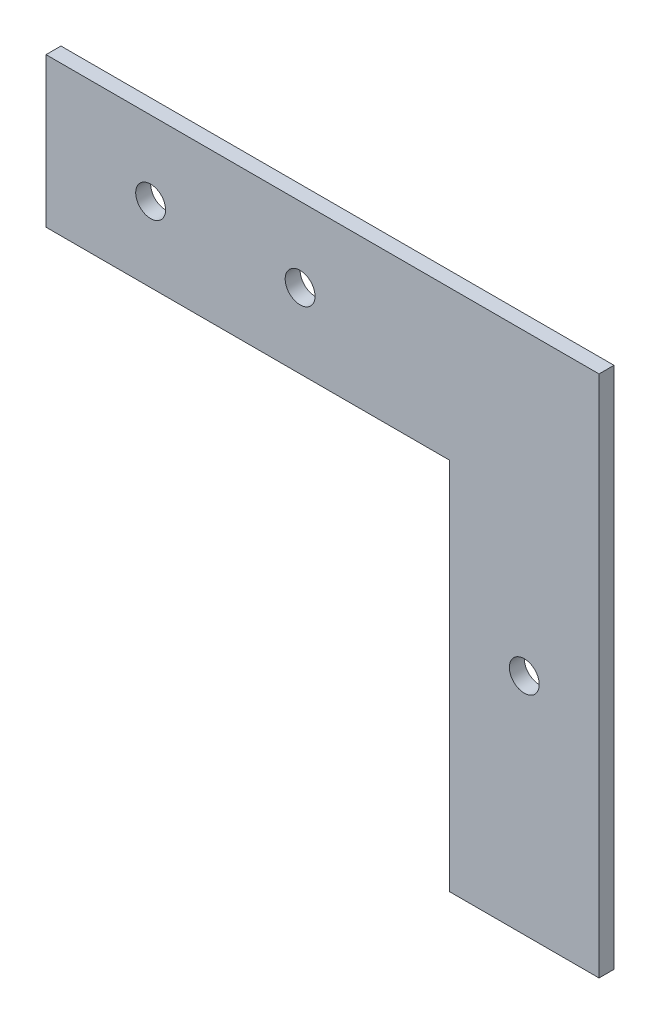
ISO-10303-21;
HEADER;
FILE_DESCRIPTION(('STEP AP214'),'2;1');
FILE_NAME('part.step','',(''),(''),'','','');
FILE_SCHEMA(('AUTOMOTIVE_DESIGN { 1 0 10303 214 1 1 1 1 }'));
ENDSEC;
DATA;
#1=APPLICATION_CONTEXT('core data for automotive mechanical design processes');
#2=APPLICATION_PROTOCOL_DEFINITION('international standard','automotive_design',2000,#1);
#3=PRODUCT_CONTEXT('',#1,'mechanical');
#4=PRODUCT('Part','Part','',(#3));
#5=PRODUCT_RELATED_PRODUCT_CATEGORY('part','',(#4));
#6=PRODUCT_DEFINITION_FORMATION('','',#4);
#7=PRODUCT_DEFINITION_CONTEXT('part definition',#1,'design');
#8=PRODUCT_DEFINITION('design','',#6,#7);
#9=PRODUCT_DEFINITION_SHAPE('','',#8);
#10=(LENGTH_UNIT() NAMED_UNIT(*) SI_UNIT(.MILLI.,.METRE.));
#11=(NAMED_UNIT(*) PLANE_ANGLE_UNIT() SI_UNIT($,.RADIAN.));
#12=(NAMED_UNIT(*) SI_UNIT($,.STERADIAN.) SOLID_ANGLE_UNIT());
#13=UNCERTAINTY_MEASURE_WITH_UNIT(LENGTH_MEASURE(1.E-05),#10,'distance_accuracy_value','');
#14=(GEOMETRIC_REPRESENTATION_CONTEXT(3) GLOBAL_UNCERTAINTY_ASSIGNED_CONTEXT((#13)) GLOBAL_UNIT_ASSIGNED_CONTEXT((#10,
#11,#12)) REPRESENTATION_CONTEXT('',''));
#15=CARTESIAN_POINT('',(0.,0.,0.));
#16=DIRECTION('',(0.,0.,1.));
#17=DIRECTION('',(1.,0.,0.));
#18=AXIS2_PLACEMENT_3D('',#15,#16,#17);
#19=CARTESIAN_POINT('',(0.,0.,2.));
#20=DIRECTION('',(0.,0.,1.));
#21=DIRECTION('',(1.,0.,0.));
#22=AXIS2_PLACEMENT_3D('',#19,#20,#21);
#23=PLANE('',#22);
#24=CARTESIAN_POINT('',(-41.6856964827124,17.5603466025537,2.));
#25=DIRECTION('',(0.,0.,1.));
#26=DIRECTION('',(1.,0.,0.));
#27=AXIS2_PLACEMENT_3D('',#24,#25,#26);
#28=CIRCLE('',#27,1.99999999999994);
#29=CARTESIAN_POINT('',(-39.6856964827124,17.5603466025537,2.));
#30=VERTEX_POINT('',#29);
#31=EDGE_CURVE('E213',#30,#30,#28,.T.);
#32=ORIENTED_EDGE('',*,*,#31,.F.);
#33=EDGE_LOOP('',(#32));
#34=FACE_BOUND('',#33,.T.);
#35=DIRECTION('',(-1.,0.,0.));
#36=VECTOR('',#35,1.);
#37=CARTESIAN_POINT('',(-55.6856964817679,27.5603466025537,2.));
#38=LINE('',#37,#36);
#39=CARTESIAN_POINT('',(18.3143035182321,27.5603466025537,2.));
#40=VERTEX_POINT('',#39);
#41=CARTESIAN_POINT('',(-55.6856964817679,27.5603466025537,2.));
#42=VERTEX_POINT('',#41);
#43=EDGE_CURVE('E152',#40,#42,#38,.T.);
#44=ORIENTED_EDGE('',*,*,#43,.T.);
#45=DIRECTION('',(0.,-1.,0.));
#46=VECTOR('',#45,1.);
#47=CARTESIAN_POINT('',(-55.6856964817679,27.5603466025537,2.));
#48=LINE('',#47,#46);
#49=CARTESIAN_POINT('',(-55.6856964817679,7.56034660255367,2.));
#50=VERTEX_POINT('',#49);
#51=EDGE_CURVE('E100',#42,#50,#48,.T.);
#52=ORIENTED_EDGE('',*,*,#51,.T.);
#53=DIRECTION('',(1.,0.,0.));
#54=VECTOR('',#53,1.);
#55=CARTESIAN_POINT('',(-55.6856964817679,7.56034660255367,2.));
#56=LINE('',#55,#54);
#57=CARTESIAN_POINT('',(-1.68569648176792,7.56034660255367,2.));
#58=VERTEX_POINT('',#57);
#59=EDGE_CURVE('E113',#50,#58,#56,.T.);
#60=ORIENTED_EDGE('',*,*,#59,.T.);
#61=DIRECTION('',(0.,-1.,0.));
#62=VECTOR('',#61,1.);
#63=CARTESIAN_POINT('',(-1.68569648176792,7.56034660255367,2.));
#64=LINE('',#63,#62);
#65=CARTESIAN_POINT('',(-1.68569648176792,-42.4396533974463,2.));
#66=VERTEX_POINT('',#65);
#67=EDGE_CURVE('E107',#58,#66,#64,.T.);
#68=ORIENTED_EDGE('',*,*,#67,.T.);
#69=DIRECTION('',(1.,0.,0.));
#70=VECTOR('',#69,1.);
#71=CARTESIAN_POINT('',(-1.68569648176792,-42.4396533974463,2.));
#72=LINE('',#71,#70);
#73=CARTESIAN_POINT('',(18.3143035182321,-42.4396533974463,2.));
#74=VERTEX_POINT('',#73);
#75=EDGE_CURVE('E111',#66,#74,#72,.T.);
#76=ORIENTED_EDGE('',*,*,#75,.T.);
#77=DIRECTION('',(0.,1.,0.));
#78=VECTOR('',#77,1.);
#79=CARTESIAN_POINT('',(18.3143035182321,-42.4396533974463,2.));
#80=LINE('',#79,#78);
#81=EDGE_CURVE('E63',#74,#40,#80,.T.);
#82=ORIENTED_EDGE('',*,*,#81,.T.);
#83=EDGE_LOOP('',(#44,#52,#60,#68,#76,#82));
#84=FACE_BOUND('',#83,.T.);
#85=CARTESIAN_POINT('',(8.31430351823209,-12.4396533974396,2.));
#86=DIRECTION('',(0.,0.,1.));
#87=DIRECTION('',(1.,0.,0.));
#88=AXIS2_PLACEMENT_3D('',#85,#86,#87);
#89=CIRCLE('',#88,2.00000000000005);
#90=CARTESIAN_POINT('',(10.3143035182321,-12.4396533974396,2.));
#91=VERTEX_POINT('',#90);
#92=EDGE_CURVE('E140',#91,#91,#89,.T.);
#93=ORIENTED_EDGE('',*,*,#92,.F.);
#94=EDGE_LOOP('',(#93));
#95=FACE_BOUND('',#94,.T.);
#96=CARTESIAN_POINT('',(-21.6856964827123,17.5603466025537,2.));
#97=DIRECTION('',(0.,0.,1.));
#98=DIRECTION('',(1.,0.,0.));
#99=AXIS2_PLACEMENT_3D('',#96,#97,#98);
#100=CIRCLE('',#99,2.);
#101=CARTESIAN_POINT('',(-19.6856964827124,17.5603466025537,2.));
#102=VERTEX_POINT('',#101);
#103=EDGE_CURVE('E202',#102,#102,#100,.T.);
#104=ORIENTED_EDGE('',*,*,#103,.F.);
#105=EDGE_LOOP('',(#104));
#106=FACE_BOUND('',#105,.T.);
#107=ADVANCED_FACE('F45',(#34,#84,#95,#106),#23,.T.);
#108=CARTESIAN_POINT('',(0.,0.,0.));
#109=DIRECTION('',(0.,0.,1.));
#110=DIRECTION('',(1.,0.,0.));
#111=AXIS2_PLACEMENT_3D('',#108,#109,#110);
#112=PLANE('',#111);
#113=DIRECTION('',(-1.,0.,0.));
#114=VECTOR('',#113,1.);
#115=CARTESIAN_POINT('',(-55.6856964817679,27.5603466025537,0.));
#116=LINE('',#115,#114);
#117=CARTESIAN_POINT('',(18.3143035182321,27.5603466025537,0.));
#118=VERTEX_POINT('',#117);
#119=CARTESIAN_POINT('',(-55.6856964817679,27.5603466025537,0.));
#120=VERTEX_POINT('',#119);
#121=EDGE_CURVE('E135',#118,#120,#116,.T.);
#122=ORIENTED_EDGE('',*,*,#121,.F.);
#123=DIRECTION('',(0.,1.,0.));
#124=VECTOR('',#123,1.);
#125=CARTESIAN_POINT('',(18.3143035182321,-42.4396533974463,0.));
#126=LINE('',#125,#124);
#127=CARTESIAN_POINT('',(18.3143035182321,-42.4396533974463,0.));
#128=VERTEX_POINT('',#127);
#129=EDGE_CURVE('E92',#128,#118,#126,.T.);
#130=ORIENTED_EDGE('',*,*,#129,.F.);
#131=DIRECTION('',(1.,0.,0.));
#132=VECTOR('',#131,1.);
#133=CARTESIAN_POINT('',(-1.68569648176792,-42.4396533974463,0.));
#134=LINE('',#133,#132);
#135=CARTESIAN_POINT('',(-1.68569648176792,-42.4396533974463,0.));
#136=VERTEX_POINT('',#135);
#137=EDGE_CURVE('E86',#136,#128,#134,.T.);
#138=ORIENTED_EDGE('',*,*,#137,.F.);
#139=DIRECTION('',(0.,-1.,0.));
#140=VECTOR('',#139,1.);
#141=CARTESIAN_POINT('',(-1.68569648176792,7.56034660255367,0.));
#142=LINE('',#141,#140);
#143=CARTESIAN_POINT('',(-1.68569648176792,7.56034660255367,0.));
#144=VERTEX_POINT('',#143);
#145=EDGE_CURVE('E122',#144,#136,#142,.T.);
#146=ORIENTED_EDGE('',*,*,#145,.F.);
#147=DIRECTION('',(1.,0.,0.));
#148=VECTOR('',#147,1.);
#149=CARTESIAN_POINT('',(-55.6856964817679,7.56034660255367,0.));
#150=LINE('',#149,#148);
#151=CARTESIAN_POINT('',(-55.6856964817679,7.56034660255367,0.));
#152=VERTEX_POINT('',#151);
#153=EDGE_CURVE('E143',#152,#144,#150,.T.);
#154=ORIENTED_EDGE('',*,*,#153,.F.);
#155=DIRECTION('',(0.,-1.,0.));
#156=VECTOR('',#155,1.);
#157=CARTESIAN_POINT('',(-55.6856964817679,27.5603466025537,0.));
#158=LINE('',#157,#156);
#159=EDGE_CURVE('E139',#120,#152,#158,.T.);
#160=ORIENTED_EDGE('',*,*,#159,.F.);
#161=EDGE_LOOP('',(#122,#130,#138,#146,#154,#160));
#162=FACE_BOUND('',#161,.T.);
#163=CARTESIAN_POINT('',(8.31430351823209,-12.4396533974396,0.));
#164=DIRECTION('',(0.,0.,1.));
#165=DIRECTION('',(1.,0.,0.));
#166=AXIS2_PLACEMENT_3D('',#163,#164,#165);
#167=CIRCLE('',#166,2.00000000000005);
#168=CARTESIAN_POINT('',(10.3143035182321,-12.4396533974396,0.));
#169=VERTEX_POINT('',#168);
#170=EDGE_CURVE('E217',#169,#169,#167,.T.);
#171=ORIENTED_EDGE('',*,*,#170,.T.);
#172=EDGE_LOOP('',(#171));
#173=FACE_BOUND('',#172,.T.);
#174=CARTESIAN_POINT('',(-41.6856964827124,17.5603466025537,0.));
#175=DIRECTION('',(0.,0.,1.));
#176=DIRECTION('',(1.,0.,0.));
#177=AXIS2_PLACEMENT_3D('',#174,#175,#176);
#178=CIRCLE('',#177,1.99999999999994);
#179=CARTESIAN_POINT('',(-39.6856964827124,17.5603466025537,0.));
#180=VERTEX_POINT('',#179);
#181=EDGE_CURVE('E210',#180,#180,#178,.T.);
#182=ORIENTED_EDGE('',*,*,#181,.T.);
#183=EDGE_LOOP('',(#182));
#184=FACE_BOUND('',#183,.T.);
#185=CARTESIAN_POINT('',(-21.6856964827123,17.5603466025537,0.));
#186=DIRECTION('',(0.,0.,1.));
#187=DIRECTION('',(1.,0.,0.));
#188=AXIS2_PLACEMENT_3D('',#185,#186,#187);
#189=CIRCLE('',#188,2.);
#190=CARTESIAN_POINT('',(-19.6856964827124,17.5603466025537,0.));
#191=VERTEX_POINT('',#190);
#192=EDGE_CURVE('E205',#191,#191,#189,.T.);
#193=ORIENTED_EDGE('',*,*,#192,.T.);
#194=EDGE_LOOP('',(#193));
#195=FACE_BOUND('',#194,.T.);
#196=ADVANCED_FACE('F165',(#162,#173,#184,#195),#112,.F.);
#197=CARTESIAN_POINT('',(-55.6856964817679,27.5603466025537,2.));
#198=DIRECTION('',(0.,-1.,0.));
#199=DIRECTION('',(0.,0.,-1.));
#200=AXIS2_PLACEMENT_3D('',#197,#198,#199);
#201=PLANE('',#200);
#202=ORIENTED_EDGE('',*,*,#121,.T.);
#203=DIRECTION('',(0.,0.,-1.));
#204=VECTOR('',#203,1.);
#205=CARTESIAN_POINT('',(-55.6856964817679,27.5603466025537,2.));
#206=LINE('',#205,#204);
#207=EDGE_CURVE('E11',#42,#120,#206,.T.);
#208=ORIENTED_EDGE('',*,*,#207,.F.);
#209=ORIENTED_EDGE('',*,*,#43,.F.);
#210=DIRECTION('',(0.,0.,-1.));
#211=VECTOR('',#210,1.);
#212=CARTESIAN_POINT('',(18.3143035182321,27.5603466025537,2.));
#213=LINE('',#212,#211);
#214=EDGE_CURVE('E131',#40,#118,#213,.T.);
#215=ORIENTED_EDGE('',*,*,#214,.T.);
#216=EDGE_LOOP('',(#202,#208,#209,#215));
#217=FACE_BOUND('',#216,.T.);
#218=ADVANCED_FACE('F47',(#217),#201,.F.);
#219=CARTESIAN_POINT('',(-55.6856964817679,27.5603466025537,2.));
#220=DIRECTION('',(1.,0.,0.));
#221=DIRECTION('',(0.,0.,-1.));
#222=AXIS2_PLACEMENT_3D('',#219,#220,#221);
#223=PLANE('',#222);
#224=ORIENTED_EDGE('',*,*,#159,.T.);
#225=DIRECTION('',(0.,0.,-1.));
#226=VECTOR('',#225,1.);
#227=CARTESIAN_POINT('',(-55.6856964817679,7.56034660255367,2.));
#228=LINE('',#227,#226);
#229=EDGE_CURVE('E55',#50,#152,#228,.T.);
#230=ORIENTED_EDGE('',*,*,#229,.F.);
#231=ORIENTED_EDGE('',*,*,#51,.F.);
#232=ORIENTED_EDGE('',*,*,#207,.T.);
#233=EDGE_LOOP('',(#224,#230,#231,#232));
#234=FACE_BOUND('',#233,.T.);
#235=ADVANCED_FACE('F276',(#234),#223,.F.);
#236=CARTESIAN_POINT('',(-55.6856964817679,7.56034660255367,2.));
#237=DIRECTION('',(0.,1.,0.));
#238=DIRECTION('',(0.,0.,1.));
#239=AXIS2_PLACEMENT_3D('',#236,#237,#238);
#240=PLANE('',#239);
#241=ORIENTED_EDGE('',*,*,#153,.T.);
#242=DIRECTION('',(0.,0.,-1.));
#243=VECTOR('',#242,1.);
#244=CARTESIAN_POINT('',(-1.68569648176792,7.56034660255367,2.));
#245=LINE('',#244,#243);
#246=EDGE_CURVE('E124',#58,#144,#245,.T.);
#247=ORIENTED_EDGE('',*,*,#246,.F.);
#248=ORIENTED_EDGE('',*,*,#59,.F.);
#249=ORIENTED_EDGE('',*,*,#229,.T.);
#250=EDGE_LOOP('',(#241,#247,#248,#249));
#251=FACE_BOUND('',#250,.T.);
#252=ADVANCED_FACE('F162',(#251),#240,.F.);
#253=CARTESIAN_POINT('',(-1.68569648176792,7.56034660255367,2.));
#254=DIRECTION('',(1.,0.,0.));
#255=DIRECTION('',(0.,0.,-1.));
#256=AXIS2_PLACEMENT_3D('',#253,#254,#255);
#257=PLANE('',#256);
#258=ORIENTED_EDGE('',*,*,#145,.T.);
#259=DIRECTION('',(0.,0.,-1.));
#260=VECTOR('',#259,1.);
#261=CARTESIAN_POINT('',(-1.68569648176792,-42.4396533974463,2.));
#262=LINE('',#261,#260);
#263=EDGE_CURVE('E119',#66,#136,#262,.T.);
#264=ORIENTED_EDGE('',*,*,#263,.F.);
#265=ORIENTED_EDGE('',*,*,#67,.F.);
#266=ORIENTED_EDGE('',*,*,#246,.T.);
#267=EDGE_LOOP('',(#258,#264,#265,#266));
#268=FACE_BOUND('',#267,.T.);
#269=ADVANCED_FACE('F120',(#268),#257,.F.);
#270=CARTESIAN_POINT('',(-1.68569648176792,-42.4396533974463,2.));
#271=DIRECTION('',(0.,1.,0.));
#272=DIRECTION('',(0.,0.,1.));
#273=AXIS2_PLACEMENT_3D('',#270,#271,#272);
#274=PLANE('',#273);
#275=ORIENTED_EDGE('',*,*,#137,.T.);
#276=DIRECTION('',(0.,0.,-1.));
#277=VECTOR('',#276,1.);
#278=CARTESIAN_POINT('',(18.3143035182321,-42.4396533974463,2.));
#279=LINE('',#278,#277);
#280=EDGE_CURVE('E125',#74,#128,#279,.T.);
#281=ORIENTED_EDGE('',*,*,#280,.F.);
#282=ORIENTED_EDGE('',*,*,#75,.F.);
#283=ORIENTED_EDGE('',*,*,#263,.T.);
#284=EDGE_LOOP('',(#275,#281,#282,#283));
#285=FACE_BOUND('',#284,.T.);
#286=ADVANCED_FACE('F127',(#285),#274,.F.);
#287=CARTESIAN_POINT('',(18.3143035182321,-42.4396533974463,2.));
#288=DIRECTION('',(-1.,0.,0.));
#289=DIRECTION('',(0.,-1.,0.));
#290=AXIS2_PLACEMENT_3D('',#287,#288,#289);
#291=PLANE('',#290);
#292=ORIENTED_EDGE('',*,*,#129,.T.);
#293=ORIENTED_EDGE('',*,*,#214,.F.);
#294=ORIENTED_EDGE('',*,*,#81,.F.);
#295=ORIENTED_EDGE('',*,*,#280,.T.);
#296=EDGE_LOOP('',(#292,#293,#294,#295));
#297=FACE_BOUND('',#296,.T.);
#298=ADVANCED_FACE('F170',(#297),#291,.F.);
#299=CARTESIAN_POINT('',(8.31430351823209,-12.4396533974396,2.));
#300=DIRECTION('',(0.,0.,-1.));
#301=DIRECTION('',(-1.,0.,0.));
#302=AXIS2_PLACEMENT_3D('',#299,#300,#301);
#303=CYLINDRICAL_SURFACE('',#302,2.00000000000005);
#304=ORIENTED_EDGE('',*,*,#92,.T.);
#305=EDGE_LOOP('',(#304));
#306=FACE_BOUND('',#305,.T.);
#307=ORIENTED_EDGE('',*,*,#170,.F.);
#308=EDGE_LOOP('',(#307));
#309=FACE_BOUND('',#308,.T.);
#310=ADVANCED_FACE('F172',(#306,#309),#303,.F.);
#311=CARTESIAN_POINT('',(-41.6856964827124,17.5603466025537,2.));
#312=DIRECTION('',(0.,0.,-1.));
#313=DIRECTION('',(-1.,0.,0.));
#314=AXIS2_PLACEMENT_3D('',#311,#312,#313);
#315=CYLINDRICAL_SURFACE('',#314,1.99999999999994);
#316=ORIENTED_EDGE('',*,*,#31,.T.);
#317=EDGE_LOOP('',(#316));
#318=FACE_BOUND('',#317,.T.);
#319=ORIENTED_EDGE('',*,*,#181,.F.);
#320=EDGE_LOOP('',(#319));
#321=FACE_BOUND('',#320,.T.);
#322=ADVANCED_FACE('F178',(#318,#321),#315,.F.);
#323=CARTESIAN_POINT('',(-21.6856964827123,17.5603466025537,2.));
#324=DIRECTION('',(0.,0.,-1.));
#325=DIRECTION('',(-1.,0.,0.));
#326=AXIS2_PLACEMENT_3D('',#323,#324,#325);
#327=CYLINDRICAL_SURFACE('',#326,2.);
#328=ORIENTED_EDGE('',*,*,#103,.T.);
#329=EDGE_LOOP('',(#328));
#330=FACE_BOUND('',#329,.T.);
#331=ORIENTED_EDGE('',*,*,#192,.F.);
#332=EDGE_LOOP('',(#331));
#333=FACE_BOUND('',#332,.T.);
#334=ADVANCED_FACE('F193',(#330,#333),#327,.F.);
#335=CLOSED_SHELL('',(#107,#196,#218,#235,#252,#269,#286,#298,#310,#322,#334));
#336=MANIFOLD_SOLID_BREP('B2',#335);
#337=ADVANCED_BREP_SHAPE_REPRESENTATION('',(#18,#336),#14);
#338=SHAPE_DEFINITION_REPRESENTATION(#9,#337);
ENDSEC;
END-ISO-10303-21;
